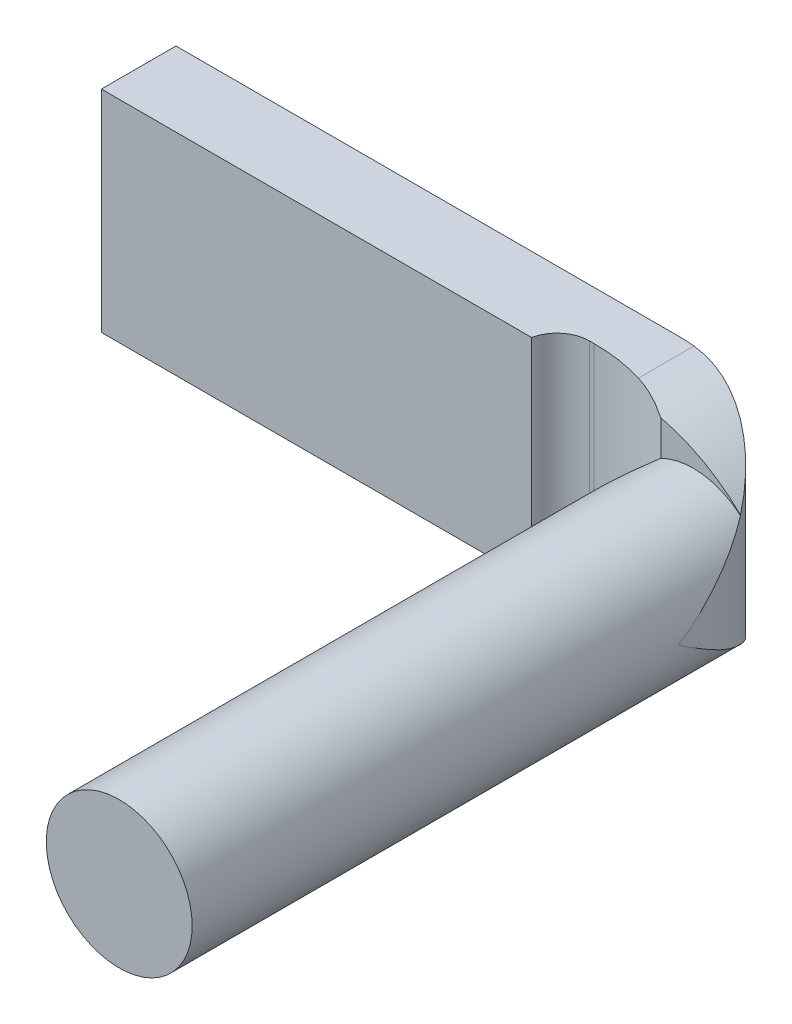
ISO-10303-21;
HEADER;
FILE_DESCRIPTION(('STEP AP214'),'2;1');
FILE_NAME('part.step','',(''),(''),'','','');
FILE_SCHEMA(('AUTOMOTIVE_DESIGN { 1 0 10303 214 1 1 1 1 }'));
ENDSEC;
DATA;
#1=APPLICATION_CONTEXT('core data for automotive mechanical design processes');
#2=APPLICATION_PROTOCOL_DEFINITION('international standard','automotive_design',2000,#1);
#3=PRODUCT_CONTEXT('',#1,'mechanical');
#4=PRODUCT('Part','Part','',(#3));
#5=PRODUCT_RELATED_PRODUCT_CATEGORY('part','',(#4));
#6=PRODUCT_DEFINITION_FORMATION('','',#4);
#7=PRODUCT_DEFINITION_CONTEXT('part definition',#1,'design');
#8=PRODUCT_DEFINITION('design','',#6,#7);
#9=PRODUCT_DEFINITION_SHAPE('','',#8);
#10=(LENGTH_UNIT() NAMED_UNIT(*) SI_UNIT(.MILLI.,.METRE.));
#11=(NAMED_UNIT(*) PLANE_ANGLE_UNIT() SI_UNIT($,.RADIAN.));
#12=(NAMED_UNIT(*) SI_UNIT($,.STERADIAN.) SOLID_ANGLE_UNIT());
#13=UNCERTAINTY_MEASURE_WITH_UNIT(LENGTH_MEASURE(1.E-05),#10,'distance_accuracy_value','');
#14=(GEOMETRIC_REPRESENTATION_CONTEXT(3) GLOBAL_UNCERTAINTY_ASSIGNED_CONTEXT((#13)) GLOBAL_UNIT_ASSIGNED_CONTEXT((#10,
#11,#12)) REPRESENTATION_CONTEXT('',''));
#15=CARTESIAN_POINT('',(0.,0.,0.));
#16=DIRECTION('',(0.,0.,1.));
#17=DIRECTION('',(1.,0.,0.));
#18=AXIS2_PLACEMENT_3D('',#15,#16,#17);
#19=CARTESIAN_POINT('',(-2.55,0.,0.));
#20=DIRECTION('',(-1.,0.,0.));
#21=DIRECTION('',(0.,0.,1.));
#22=AXIS2_PLACEMENT_3D('',#19,#20,#21);
#23=PLANE('',#22);
#24=DIRECTION('',(0.,0.,-1.));
#25=VECTOR('',#24,1.);
#26=CARTESIAN_POINT('',(-2.55,0.325,0.115));
#27=LINE('',#26,#25);
#28=CARTESIAN_POINT('',(-2.55,0.325,0.23));
#29=VERTEX_POINT('',#28);
#30=CARTESIAN_POINT('',(-2.55,0.325,0.));
#31=VERTEX_POINT('',#30);
#32=EDGE_CURVE('E11',#29,#31,#27,.T.);
#33=ORIENTED_EDGE('',*,*,#32,.T.);
#34=DIRECTION('',(0.,1.,0.));
#35=VECTOR('',#34,1.);
#36=CARTESIAN_POINT('',(-2.55,0.,0.));
#37=LINE('',#36,#35);
#38=CARTESIAN_POINT('',(-2.55,-0.325,0.));
#39=VERTEX_POINT('',#38);
#40=EDGE_CURVE('E43',#39,#31,#37,.T.);
#41=ORIENTED_EDGE('',*,*,#40,.F.);
#42=DIRECTION('',(0.,0.,-1.));
#43=VECTOR('',#42,1.);
#44=CARTESIAN_POINT('',(-2.55,-0.325,0.115));
#45=LINE('',#44,#43);
#46=CARTESIAN_POINT('',(-2.55,-0.325,0.23));
#47=VERTEX_POINT('',#46);
#48=EDGE_CURVE('E248',#47,#39,#45,.T.);
#49=ORIENTED_EDGE('',*,*,#48,.F.);
#50=DIRECTION('',(0.,1.,0.));
#51=VECTOR('',#50,1.);
#52=CARTESIAN_POINT('',(-2.55,0.,0.23));
#53=LINE('',#52,#51);
#54=EDGE_CURVE('E34',#47,#29,#53,.T.);
#55=ORIENTED_EDGE('',*,*,#54,.T.);
#56=EDGE_LOOP('',(#33,#41,#49,#55));
#57=FACE_BOUND('',#56,.T.);
#58=ADVANCED_FACE('F18',(#57),#23,.T.);
#59=CARTESIAN_POINT('',(-0.725,0.,2.));
#60=DIRECTION('',(0.,0.,1.));
#61=DIRECTION('',(-1.,0.,0.));
#62=AXIS2_PLACEMENT_3D('',#59,#60,#61);
#63=PLANE('',#62);
#64=CARTESIAN_POINT('',(-0.725,0.,2.));
#65=DIRECTION('',(0.,0.,1.));
#66=DIRECTION('',(1.,0.,0.));
#67=AXIS2_PLACEMENT_3D('',#64,#65,#66);
#68=CIRCLE('',#67,0.225);
#69=CARTESIAN_POINT('',(-0.5,0.,2.));
#70=VERTEX_POINT('',#69);
#71=EDGE_CURVE('E286',#70,#70,#68,.T.);
#72=ORIENTED_EDGE('',*,*,#71,.T.);
#73=EDGE_LOOP('',(#72));
#74=FACE_BOUND('',#73,.T.);
#75=ADVANCED_FACE('F294',(#74),#63,.T.);
#76=CARTESIAN_POINT('',(-0.95,0.,0.));
#77=DIRECTION('',(0.,0.,-1.));
#78=DIRECTION('',(-1.,0.,0.));
#79=AXIS2_PLACEMENT_3D('',#76,#77,#78);
#80=PLANE('',#79);
#81=DIRECTION('',(1.,0.,0.));
#82=VECTOR('',#81,1.);
#83=CARTESIAN_POINT('',(-1.775,-0.325,0.));
#84=LINE('',#83,#82);
#85=CARTESIAN_POINT('',(-1.,-0.325,0.));
#86=VERTEX_POINT('',#85);
#87=EDGE_CURVE('E264',#39,#86,#84,.T.);
#88=ORIENTED_EDGE('',*,*,#87,.F.);
#89=ORIENTED_EDGE('',*,*,#40,.T.);
#90=DIRECTION('',(1.,0.,0.));
#91=VECTOR('',#90,1.);
#92=CARTESIAN_POINT('',(-1.775,0.325,0.));
#93=LINE('',#92,#91);
#94=CARTESIAN_POINT('',(-1.,0.325,0.));
#95=VERTEX_POINT('',#94);
#96=EDGE_CURVE('E239',#31,#95,#93,.T.);
#97=ORIENTED_EDGE('',*,*,#96,.T.);
#98=DIRECTION('',(0.,-1.,0.));
#99=VECTOR('',#98,1.);
#100=CARTESIAN_POINT('',(-1.,0.,0.));
#101=LINE('',#100,#99);
#102=EDGE_CURVE('E237',#95,#86,#101,.T.);
#103=ORIENTED_EDGE('',*,*,#102,.T.);
#104=EDGE_LOOP('',(#88,#89,#97,#103));
#105=FACE_BOUND('',#104,.T.);
#106=ADVANCED_FACE('F292',(#105),#80,.T.);
#107=CARTESIAN_POINT('',(-1.,0.,0.5));
#108=DIRECTION('',(0.,-1.,0.));
#109=DIRECTION('',(0.,0.,-1.));
#110=AXIS2_PLACEMENT_3D('',#107,#108,#109);
#111=CYLINDRICAL_SURFACE('',#110,0.5);
#112=CARTESIAN_POINT('',(-1.,0.325,0.5));
#113=DIRECTION('',(0.,-1.,0.));
#114=DIRECTION('',(1.,0.,0.));
#115=AXIS2_PLACEMENT_3D('',#112,#113,#114);
#116=CIRCLE('',#115,0.5);
#117=CARTESIAN_POINT('',(-0.95,0.325,0.00250628144669002));
#118=VERTEX_POINT('',#117);
#119=EDGE_CURVE('E215',#95,#118,#116,.T.);
#120=ORIENTED_EDGE('',*,*,#119,.T.);
#121=CARTESIAN_POINT('',(-0.579167491749967,0.172905938131077,0.230000000000027));
#122=CARTESIAN_POINT('',(-0.594481525065583,0.188039794505541,0.206193075913775));
#123=CARTESIAN_POINT('',(-0.611813178746644,0.203249229350374,0.183578997305729));
#124=CARTESIAN_POINT('',(-0.650742706479108,0.232717496682813,0.141012563586862));
#125=CARTESIAN_POINT('',(-0.672390528760634,0.246962302652992,0.121096449289508));
#126=CARTESIAN_POINT('',(-0.714567445336262,0.270089914317339,0.088824390277777));
#127=CARTESIAN_POINT('',(-0.73428674237854,0.279462020808014,0.075770332042518));
#128=CARTESIAN_POINT('',(-0.775945619935217,0.29599327411751,0.052376650463509));
#129=CARTESIAN_POINT('',(-0.797868075556542,0.303167965097133,0.0420180423441926));
#130=CARTESIAN_POINT('',(-0.8410050902512,0.314049205941591,0.0254605018314506));
#131=CARTESIAN_POINT('',(-0.862008945004077,0.318060620307345,0.0189193070948811));
#132=CARTESIAN_POINT('',(-0.905259136136628,0.323566558397666,0.00853962233083629));
#133=CARTESIAN_POINT('',(-0.927517538496798,0.325029657332423,0.00473521208001916));
#134=CARTESIAN_POINT('',(-0.95,0.325,0.00250628144669));
#135=B_SPLINE_CURVE_WITH_KNOTS('',3,(#121,#122,#123,#124,#125,#126,#127,#128,#129,#130,#131,
#132,#133,#134),.UNSPECIFIED.,.F.,.F.,(4,2,2,2,2,2,4),(0.,0.0964010493014831,0.193990237511447,
0.270015277748108,0.345489399076702,0.412245993738809,0.479820124814963),.UNSPECIFIED.);
#136=CARTESIAN_POINT('',(-0.579167491749983,0.172905938131093,0.230000000000013));
#137=VERTEX_POINT('',#136);
#138=EDGE_CURVE('E133',#137,#118,#135,.T.);
#139=ORIENTED_EDGE('',*,*,#138,.F.);
#140=DIRECTION('',(0.,-1.,0.));
#141=VECTOR('',#140,1.);
#142=CARTESIAN_POINT('',(-0.57916749175,0.,0.23));
#143=LINE('',#142,#141);
#144=CARTESIAN_POINT('',(-0.57916749175,0.171341412208,0.23));
#145=VERTEX_POINT('',#144);
#146=EDGE_CURVE('E159',#137,#145,#143,.T.);
#147=ORIENTED_EDGE('',*,*,#146,.T.);
#148=CARTESIAN_POINT('',(-0.527543923575,0.107870746186,0.336337982877));
#149=CARTESIAN_POINT('',(-0.540125816335,0.130901746399,0.3000168389));
#150=CARTESIAN_POINT('',(-0.557180986132,0.152628205514,0.264269023359));
#151=CARTESIAN_POINT('',(-0.57916749175,0.171341412208,0.23));
#152=B_SPLINE_CURVE_WITH_KNOTS('',3,(#148,#149,#150,#151),.UNSPECIFIED.,.F.,.F.,(4,4),(0.,
0.190113694744),.UNSPECIFIED.);
#153=CARTESIAN_POINT('',(-0.527543923575,0.107870746186,0.336337982877));
#154=VERTEX_POINT('',#153);
#155=EDGE_CURVE('E191',#154,#145,#152,.T.);
#156=ORIENTED_EDGE('',*,*,#155,.F.);
#157=CARTESIAN_POINT('',(-0.527543923574693,0.107870746185996,0.336337982876891));
#158=CARTESIAN_POINT('',(-0.518440960230583,0.0911460138156062,0.36268821599974));
#159=CARTESIAN_POINT('',(-0.511636501217818,0.0737207800982361,0.389378552485713));
#160=CARTESIAN_POINT('',(-0.502543032630099,0.0383528458116824,0.442818084704401));
#161=CARTESIAN_POINT('',(-0.500211820365034,0.0204166183388116,0.469564322782211));
#162=CARTESIAN_POINT('',(-0.500004618686017,0.00166086531989147,0.497524114394659));
#163=CARTESIAN_POINT('',(-0.500000022910573,0.000830403620367272,0.498762092329549));
#164=CARTESIAN_POINT('',(-0.5,0.,0.5));
#165=B_SPLINE_CURVE_WITH_KNOTS('',3,(#157,#158,#159,#160,#161,#162,#163,#164),.UNSPECIFIED.,.F.,
.F.,(4,2,2,4),(0.,0.0974514562798899,0.193978900600145,0.198451057847243),.UNSPECIFIED.);
#166=CARTESIAN_POINT('',(-0.5,0.,0.5));
#167=VERTEX_POINT('',#166);
#168=EDGE_CURVE('E183',#167,#154,#165,.F.);
#169=ORIENTED_EDGE('',*,*,#168,.F.);
#170=CARTESIAN_POINT('',(-0.5,0.,0.5));
#171=CARTESIAN_POINT('',(-0.499999999999995,-5.7746565647226E-07,0.499999999719079));
#172=CARTESIAN_POINT('',(-0.50000000000294,-1.15490033675771E-06,0.499999936684402));
#173=CARTESIAN_POINT('',(-0.500000000013319,-2.29213045936201E-06,0.499999715348737));
#174=CARTESIAN_POINT('',(-0.500000000020776,-2.85182163147612E-06,0.499999556566385));
#175=CARTESIAN_POINT('',(-0.500000000039255,-3.95919585697985E-06,0.499999163683635));
#176=CARTESIAN_POINT('',(-0.50000000005036,-4.50623468956113E-06,0.499998927809302));
#177=CARTESIAN_POINT('',(-0.500000000075246,-5.57081136091133E-06,0.499998399947566));
#178=CARTESIAN_POINT('',(-0.500000000089024,-6.0883866244889E-06,0.499998108033506));
#179=CARTESIAN_POINT('',(-0.500000000136034,-7.70017729146235E-06,0.499997113561711));
#180=CARTESIAN_POINT('',(-0.500000000172913,-8.74810924054418E-06,0.499996335521057));
#181=CARTESIAN_POINT('',(-0.500000000252641,-1.0722570934034E-05,0.499994661489089));
#182=CARTESIAN_POINT('',(-0.500000000295434,-1.16501206008797E-05,0.499993766638062));
#183=CARTESIAN_POINT('',(-0.500000000450473,-1.47809998148364E-05,0.49999054380303));
#184=CARTESIAN_POINT('',(-0.50000000057136,-1.68299526184926E-05,0.499988063824963));
#185=CARTESIAN_POINT('',(-0.500000000825262,-2.04891682177724E-05,0.499982955865055));
#186=CARTESIAN_POINT('',(-0.500000000957627,-2.21133258570544E-05,0.499980337308505));
#187=CARTESIAN_POINT('',(-0.500000001486064,-2.82969486640992E-05,0.499970081006428));
#188=CARTESIAN_POINT('',(-0.500000001908255,-3.26097381353135E-05,0.499962299705483));
#189=CARTESIAN_POINT('',(-0.500000003011803,-4.01888087849095E-05,0.499947221084814));
#190=CARTESIAN_POINT('',(-0.500000003662283,-4.3516987373918E-05,0.499939955514118));
#191=CARTESIAN_POINT('',(-0.500000009147845,-6.75531891366545E-05,0.499891664233341));
#192=CARTESIAN_POINT('',(-0.500000019154832,-9.55202945833925E-05,0.499854710242689));
#193=CARTESIAN_POINT('',(-0.500000071572373,-0.000195367716785842,0.499716794837562));
#194=CARTESIAN_POINT('',(-0.500000140170535,-0.000261824816654125,0.499612916125663));
#195=CARTESIAN_POINT('',(-0.500000511581878,-0.000511006351205102,0.499230256781094));
#196=CARTESIAN_POINT('',(-0.500001014312389,-0.000699268173762711,0.498954443484109));
#197=CARTESIAN_POINT('',(-0.500003856194312,-0.00142606385921486,0.497883206572794));
#198=CARTESIAN_POINT('',(-0.500007871087961,-0.00195854133345431,0.497084556640982));
#199=CARTESIAN_POINT('',(-0.500076771192126,-0.00815726539404534,0.487795076818709));
#200=CARTESIAN_POINT('',(-0.500355441973697,-0.0138606232141957,0.479324064520508));
#201=CARTESIAN_POINT('',(-0.501331477690675,-0.0250674376145888,0.462615124055144));
#202=CARTESIAN_POINT('',(-0.502017105012857,-0.0305720749594833,0.454377199139787));
#203=CARTESIAN_POINT('',(-0.503879468104124,-0.0420390434768299,0.437184141332002));
#204=CARTESIAN_POINT('',(-0.505094716957693,-0.0479981716614765,0.428230911047886));
#205=CARTESIAN_POINT('',(-0.508029105175276,-0.0598869898264683,0.41029025565808));
#206=CARTESIAN_POINT('',(-0.509751945286597,-0.0658161262813432,0.401303075638004));
#207=CARTESIAN_POINT('',(-0.514883636991639,-0.0810810419502258,0.378029195880052));
#208=CARTESIAN_POINT('',(-0.51868534260577,-0.090340772860088,0.363776791364767));
#209=CARTESIAN_POINT('',(-0.527540539772817,-0.108320981797468,0.335698665857435));
#210=CARTESIAN_POINT('',(-0.532570656091618,-0.117048107823722,0.321869859257526));
#211=CARTESIAN_POINT('',(-0.542550377348907,-0.131894059665949,0.29785061018629));
#212=CARTESIAN_POINT('',(-0.547210651747034,-0.138123044146713,0.287608280410997));
#213=CARTESIAN_POINT('',(-0.557326571805109,-0.150243859940892,0.267255313930031));
#214=CARTESIAN_POINT('',(-0.562785428053575,-0.156134189896859,0.257145397304276));
#215=CARTESIAN_POINT('',(-0.580837760024188,-0.173578854076331,0.226352870219456));
#216=CARTESIAN_POINT('',(-0.594785929724175,-0.184404898280911,0.206003966195183));
#217=CARTESIAN_POINT('',(-0.621854431080329,-0.200394370742645,0.172386499919227));
#218=CARTESIAN_POINT('',(-0.634084338281593,-0.206292760317813,0.158748714413746));
#219=CARTESIAN_POINT('',(-0.660296698872883,-0.215942677378491,0.132659767095127));
#220=CARTESIAN_POINT('',(-0.674260735195237,-0.219714746487253,0.12019825499181));
#221=CARTESIAN_POINT('',(-0.700478133339872,-0.223959872929676,0.0993747031610667));
#222=CARTESIAN_POINT('',(-0.712408754564794,-0.22498449641405,0.0907213815422376));
#223=CARTESIAN_POINT('',(-0.73702286650893,-0.225015144183454,0.0744885496194592));
#224=CARTESIAN_POINT('',(-0.749707179184749,-0.224018923858933,0.0669102433692606));
#225=CARTESIAN_POINT('',(-0.775502345527364,-0.219651601881529,0.0529908897163963));
#226=CARTESIAN_POINT('',(-0.788615888039904,-0.216260611500969,0.0466607758104441));
#227=CARTESIAN_POINT('',(-0.814529567613934,-0.20687822084177,0.0354577109840535));
#228=CARTESIAN_POINT('',(-0.827330056476005,-0.200889895998203,0.0305830481924773));
#229=CARTESIAN_POINT('',(-0.85010565122619,-0.187410469631852,0.0228676611263404));
#230=CARTESIAN_POINT('',(-0.860221057719746,-0.180264084031154,0.0198343320112318));
#231=CARTESIAN_POINT('',(-0.879265691651152,-0.164260838122762,0.0146953957088722));
#232=CARTESIAN_POINT('',(-0.888195066049429,-0.155404190066863,0.0125896735074381));
#233=CARTESIAN_POINT('',(-0.904079409072409,-0.136740622816675,0.0092230938156569));
#234=CARTESIAN_POINT('',(-0.911112900633754,-0.127007064066505,0.00792399791257257));
#235=CARTESIAN_POINT('',(-0.923558664861053,-0.106504791521638,0.00583743618475401));
#236=CARTESIAN_POINT('',(-0.92897091216383,-0.0957360615359296,0.00504997836399645));
#237=CARTESIAN_POINT('',(-0.938112091955226,-0.0732072425005823,0.00382284058893593));
#238=CARTESIAN_POINT('',(-0.941800864215151,-0.0614304197024931,0.00339129391930888));
#239=CARTESIAN_POINT('',(-0.947206494141587,-0.0374257349796377,0.00278747785699791));
#240=CARTESIAN_POINT('',(-0.948923119734283,-0.0251978201469916,0.00261523897780932));
#241=CARTESIAN_POINT('',(-0.950348930624402,-0.000388879574343036,0.00247075344644313));
#242=CARTESIAN_POINT('',(-0.950019109389979,0.0121944276147387,0.00250239328482872));
#243=CARTESIAN_POINT('',(-0.947269624855378,0.0371288753863014,0.00278639433458647));
#244=CARTESIAN_POINT('',(-0.944849822592343,0.0494800004751957,0.0030387702227148));
#245=CARTESIAN_POINT('',(-0.937982004667755,0.0736321856334904,0.00384914197937647));
#246=CARTESIAN_POINT('',(-0.933528419636025,0.0854316365257677,0.00440797791671894));
#247=CARTESIAN_POINT('',(-0.922729942132688,0.108099093597959,0.00597677278862145));
#248=CARTESIAN_POINT('',(-0.916385197855847,0.118967172676019,0.00698669637820217));
#249=CARTESIAN_POINT('',(-0.902105724281706,0.139324258838854,0.00962402814170151));
#250=CARTESIAN_POINT('',(-0.894190994276466,0.148828253525003,0.0112438789247749));
#251=CARTESIAN_POINT('',(-0.877017293987928,0.166330810463455,0.0152807216180426));
#252=CARTESIAN_POINT('',(-0.867758750505332,0.174329848850762,0.0176974607420052));
#253=CARTESIAN_POINT('',(-0.84852673422226,0.188426462502223,0.0233937029224233));
#254=CARTESIAN_POINT('',(-0.838578817349748,0.194568942012197,0.0266485564598081));
#255=CARTESIAN_POINT('',(-0.818149199673654,0.2051353575974,0.0341153997181115));
#256=CARTESIAN_POINT('',(-0.807667566804579,0.209559511775742,0.0383272678597143));
#257=CARTESIAN_POINT('',(-0.786473842230216,0.216730603910395,0.0477368422310753));
#258=CARTESIAN_POINT('',(-0.775760598585738,0.219464393684984,0.0529418745510266));
#259=CARTESIAN_POINT('',(-0.754514982605415,0.22331752956292,0.0642450245099114));
#260=CARTESIAN_POINT('',(-0.743982786150128,0.224435384744095,0.0703439611930672));
#261=CARTESIAN_POINT('',(-0.719611343201793,0.22537479351995,0.0856845508384899));
#262=CARTESIAN_POINT('',(-0.705959886051496,0.224578281408322,0.0952632311985519));
#263=CARTESIAN_POINT('',(-0.67989469499513,0.220826438718933,0.115543888077977));
#264=CARTESIAN_POINT('',(-0.667480304880629,0.217872259688941,0.126245262806983));
#265=CARTESIAN_POINT('',(-0.639667805980957,0.208876350137451,0.152650011685078));
#266=CARTESIAN_POINT('',(-0.624874286057326,0.20209534970616,0.168734848432987));
#267=CARTESIAN_POINT('',(-0.597757873270918,0.186239466367043,0.202218744452926));
#268=CARTESIAN_POINT('',(-0.585474521489806,0.177132309856792,0.219633654588824));
#269=CARTESIAN_POINT('',(-0.566481219060837,0.160040585333462,0.250411071204898));
#270=CARTESIAN_POINT('',(-0.559160711928939,0.152412506091202,0.263604271008855));
#271=CARTESIAN_POINT('',(-0.545847165240752,0.136517304932122,0.290313784774415));
#272=CARTESIAN_POINT('',(-0.539856823018651,0.12824892956004,0.303830694803816));
#273=CARTESIAN_POINT('',(-0.529488196523895,0.111755532426113,0.3302703312761));
#274=CARTESIAN_POINT('',(-0.525035345630349,0.103557053487986,0.343180719778308));
#275=CARTESIAN_POINT('',(-0.517262496194663,0.0869132959860724,0.369057948462132));
#276=CARTESIAN_POINT('',(-0.513935415289248,0.0784699374909866,0.382023895553537));
#277=CARTESIAN_POINT('',(-0.509543915178299,0.0650393397582102,0.40247698984575));
#278=CARTESIAN_POINT('',(-0.508120563149782,0.0601196881791561,0.409933732734089));
#279=CARTESIAN_POINT('',(-0.505594505948632,0.050132147477499,0.425014585876456));
#280=CARTESIAN_POINT('',(-0.504498516434583,0.0450632295577383,0.432639149723475));
#281=CARTESIAN_POINT('',(-0.502417456804449,0.0335401408340406,0.449937456085319));
#282=CARTESIAN_POINT('',(-0.501539288877064,0.0270758654199153,0.459617230688682));
#283=CARTESIAN_POINT('',(-0.500390330425554,0.0145557655041719,0.478286356082829));
#284=CARTESIAN_POINT('',(-0.500080623086274,0.00850376100733665,0.487275617334357));
#285=CARTESIAN_POINT('',(-0.500007883608312,0.00195967380727145,0.497082879224255));
#286=CARTESIAN_POINT('',(-0.500003873126859,0.00142830634799508,0.49787984011282));
#287=CARTESIAN_POINT('',(-0.500001021687495,0.000701839873785785,0.498950597762499));
#288=CARTESIAN_POINT('',(-0.500000514979559,0.000512762286796911,0.499227600442628));
#289=CARTESIAN_POINT('',(-0.500000140932095,0.000262556252120364,0.499611842206289));
#290=CARTESIAN_POINT('',(-0.500000071902896,0.000195859263933365,0.499716098894184));
#291=CARTESIAN_POINT('',(-0.500000019217309,9.56803685713167E-05,0.499854463723489));
#292=CARTESIAN_POINT('',(-0.500000009170935,6.76484938693015E-05,0.499891502115669));
#293=CARTESIAN_POINT('',(-0.500000003668987,4.35707559920982E-05,0.499939900840703));
#294=CARTESIAN_POINT('',(-0.500000003017216,4.02399276543902E-05,0.4999471760554));
#295=CARTESIAN_POINT('',(-0.500000001911515,3.26518440456769E-05,0.499962274440237));
#296=CARTESIAN_POINT('',(-0.500000001488566,2.83322837427971E-05,0.499970065662499));
#297=CARTESIAN_POINT('',(-0.500000000959202,2.21390336537735E-05,0.49998033317559));
#298=CARTESIAN_POINT('',(-0.500000000826646,2.0512880538958E-05,0.499982953623646));
#299=CARTESIAN_POINT('',(-0.500000000572357,1.68488603562364E-05,0.499988064910426));
#300=CARTESIAN_POINT('',(-0.500000000451274,1.47970605402023E-05,0.499990546292259));
#301=CARTESIAN_POINT('',(-0.500000000295982,1.16620070598943E-05,0.499993770350119));
#302=CARTESIAN_POINT('',(-0.500000000253124,1.0733340887953E-05,0.499994665381864));
#303=CARTESIAN_POINT('',(-0.500000000173267,8.75653208842286E-06,0.499996339542637));
#304=CARTESIAN_POINT('',(-0.500000000136325,7.70736783759915E-06,0.499997117528257));
#305=CARTESIAN_POINT('',(-0.500000000089232,6.09378934873127E-06,0.49999811165523));
#306=CARTESIAN_POINT('',(-0.500000000075429,5.57567330498644E-06,0.499998403415165));
#307=CARTESIAN_POINT('',(-0.500000000050495,4.51001676625306E-06,0.49999893087842));
#308=CARTESIAN_POINT('',(-0.500000000039368,3.9624388036974E-06,0.499999166508188));
#309=CARTESIAN_POINT('',(-0.500000000020849,2.8540342160401E-06,0.499999558792632));
#310=CARTESIAN_POINT('',(-0.500000000013373,2.29385176436228E-06,0.499999717225388));
#311=CARTESIAN_POINT('',(-0.500000000002963,1.15569978006618E-06,0.499999937728278));
#312=CARTESIAN_POINT('',(-0.500000000000005,5.7783438215433E-07,0.5000000002811));
#313=CARTESIAN_POINT('',(-0.5,0.,0.5));
#314=B_SPLINE_CURVE_WITH_KNOTS('',3,(#170,#171,#172,#173,#174,#175,#176,#177,#178,#179,#180,
#181,#182,#183,#184,#185,#186,#187,#188,#189,#190,#191,#192,#193,#194,#195,#196,#197,#198,#199,
#200,#201,#202,#203,#204,#205,#206,#207,#208,#209,#210,#211,#212,#213,#214,#215,#216,#217,#218,
#219,#220,#221,#222,#223,#224,#225,#226,#227,#228,#229,#230,#231,#232,#233,#234,#235,#236,#237,
#238,#239,#240,#241,#242,#243,#244,#245,#246,#247,#248,#249,#250,#251,#252,#253,#254,#255,#256,
#257,#258,#259,#260,#261,#262,#263,#264,#265,#266,#267,#268,#269,#270,#271,#272,#273,#274,#275,
#276,#277,#278,#279,#280,#281,#282,#283,#284,#285,#286,#287,#288,#289,#290,#291,#292,#293,#294,
#295,#296,#297,#298,#299,#300,#301,#302,#303,#304,#305,#306,#307,#308,#309,#310,#311,#312,#313),
.UNSPECIFIED.,.T.,.F.,(4,2,2,2,2,2,2,2,2,2,2,2,2,2,2,2,2,2,2,2,2,2,2,2,2,2,2,2,2,2,2,2,2,2,2,2,
2,2,2,2,2,2,2,2,2,2,2,2,2,2,2,2,2,2,2,2,2,2,2,2,2,2,2,2,2,2,2,2,2,2,2,4),(0.,
1.73081609835374E-06,3.47040716672475E-06,5.25323568498868E-06,7.03374665238368E-06,
1.09318336468315E-05,1.479437407244E-05,2.44017944221211E-05,3.36378795214498E-05,
6.03092519918189E-05,8.42563181139126E-05,0.00022229250040564,0.000592952753172089,
0.00159392482742708,0.00447441292107584,0.0351056803844816,0.0648936861097581,
0.0973518372798823,0.130052751359972,0.182245940080448,0.23351427084973,0.272069646372068,
0.310784520242123,0.391173575239965,0.448726169459282,0.505712797126296,0.54986855272862,
0.594073380257858,0.638649716128756,0.683173413817709,0.721228691202684,0.759279248776537,
0.79535121866181,0.831423752837083,0.868299408427032,0.905179402942621,0.94276448458506,
0.980352065452337,1.01804320026582,1.05573138230784,1.09296718008298,1.13019117738902,
1.1664253914743,1.20265500492933,1.23916299081471,1.27570463889255,1.32551453812584,
1.37529787320142,1.44357334310021,1.51285307643799,1.56350643073711,1.61426158143418,
1.6620048928502,1.70944200370326,1.73657454047807,1.76423051775385,1.79923699712073,
1.83174205744391,1.83461647806194,1.83562177017628,1.8359937781864,1.83613212927437,
1.83615610585096,1.83618281286499,1.83619205690209,1.83620167287116,1.83620553819121,
1.83620943911154,1.83621122080514,1.83621300482074,1.83621474553438,1.83621647745565),.UNSPECIFIED.);
#315=CARTESIAN_POINT('',(-0.57916749175,-0.17134141220812,0.23));
#316=VERTEX_POINT('',#315);
#317=EDGE_CURVE('E150',#167,#316,#314,.T.);
#318=ORIENTED_EDGE('',*,*,#317,.T.);
#319=DIRECTION('',(0.,-1.,0.));
#320=VECTOR('',#319,1.);
#321=CARTESIAN_POINT('',(-0.57916749175,0.,0.23));
#322=LINE('',#321,#320);
#323=CARTESIAN_POINT('',(-0.579167491749983,-0.172905938131093,0.230000000000013));
#324=VERTEX_POINT('',#323);
#325=EDGE_CURVE('E160',#316,#324,#322,.T.);
#326=ORIENTED_EDGE('',*,*,#325,.T.);
#327=CARTESIAN_POINT('',(-0.579167491749967,-0.172905938131077,0.230000000000027));
#328=CARTESIAN_POINT('',(-0.594481525065583,-0.188039794505541,0.206193075913775));
#329=CARTESIAN_POINT('',(-0.611813178746644,-0.203249229350374,0.183578997305729));
#330=CARTESIAN_POINT('',(-0.650742706479108,-0.232717496682813,0.141012563586862));
#331=CARTESIAN_POINT('',(-0.672390528760634,-0.246962302652992,0.121096449289508));
#332=CARTESIAN_POINT('',(-0.714567445336262,-0.270089914317339,0.088824390277777));
#333=CARTESIAN_POINT('',(-0.73428674237854,-0.279462020808014,0.075770332042518));
#334=CARTESIAN_POINT('',(-0.775945619935217,-0.29599327411751,0.052376650463509));
#335=CARTESIAN_POINT('',(-0.797868075556542,-0.303167965097133,0.0420180423441926));
#336=CARTESIAN_POINT('',(-0.8410050902512,-0.314049205941591,0.0254605018314506));
#337=CARTESIAN_POINT('',(-0.862008945004077,-0.318060620307345,0.0189193070948811));
#338=CARTESIAN_POINT('',(-0.905259136136628,-0.323566558397666,0.00853962233083629));
#339=CARTESIAN_POINT('',(-0.927517538496798,-0.325029657332423,0.00473521208001916));
#340=CARTESIAN_POINT('',(-0.95,-0.325,0.00250628144669));
#341=B_SPLINE_CURVE_WITH_KNOTS('',3,(#327,#328,#329,#330,#331,#332,#333,#334,#335,#336,#337,
#338,#339,#340),.UNSPECIFIED.,.F.,.F.,(4,2,2,2,2,2,4),(0.,0.0964010493014831,0.193990237511447,
0.270015277748108,0.345489399076702,0.412245993738809,0.479820124814963),.UNSPECIFIED.);
#342=CARTESIAN_POINT('',(-0.95,-0.325,0.00250628144669002));
#343=VERTEX_POINT('',#342);
#344=EDGE_CURVE('E161',#324,#343,#341,.T.);
#345=ORIENTED_EDGE('',*,*,#344,.T.);
#346=CARTESIAN_POINT('',(-1.,-0.325,0.5));
#347=DIRECTION('',(0.,-1.,0.));
#348=DIRECTION('',(1.,0.,0.));
#349=AXIS2_PLACEMENT_3D('',#346,#347,#348);
#350=CIRCLE('',#349,0.5);
#351=EDGE_CURVE('E263',#86,#343,#350,.T.);
#352=ORIENTED_EDGE('',*,*,#351,.F.);
#353=ORIENTED_EDGE('',*,*,#102,.F.);
#354=EDGE_LOOP('',(#120,#139,#147,#156,#169,#318,#326,#345,#352,#353));
#355=FACE_BOUND('',#354,.T.);
#356=ADVANCED_FACE('F168',(#355),#111,.T.);
#357=CARTESIAN_POINT('',(-0.95,0.20312499994,0.72500000001));
#358=DIRECTION('',(0.,0.,-1.));
#359=DIRECTION('',(0.742268041335985,-0.670103092673986,0.));
#360=AXIS2_PLACEMENT_3D('',#357,#358,#359);
#361=CYLINDRICAL_SURFACE('',#360,0.52812499994);
#362=CARTESIAN_POINT('',(-0.825000000007677,-0.309993909829991,0.230000000006448));
#363=CARTESIAN_POINT('',(-0.834676549379911,-0.312352127918611,0.224117498867494));
#364=CARTESIAN_POINT('',(-0.844580958306375,-0.314473933293907,0.218508410761073));
#365=CARTESIAN_POINT('',(-0.864731610632075,-0.318170851198056,0.207913516823226));
#366=CARTESIAN_POINT('',(-0.874975234024688,-0.319749405079866,0.202923920506511));
#367=CARTESIAN_POINT('',(-0.895818132432998,-0.322318155738325,0.193566781305209));
#368=CARTESIAN_POINT('',(-0.906417457715009,-0.32330826898595,0.189199326800389));
#369=CARTESIAN_POINT('',(-0.927972917053432,-0.324652075526652,0.181096876654668));
#370=CARTESIAN_POINT('',(-0.93893092218072,-0.325001591338716,0.177366175373865));
#371=CARTESIAN_POINT('',(-0.950000000000394,-0.325,0.173987372509291));
#372=B_SPLINE_CURVE_WITH_KNOTS('',3,(#362,#363,#364,#365,#366,#367,#368,#369,#370,#371),
.UNSPECIFIED.,.F.,.F.,(4,2,2,2,4),(0.,0.0346987807954748,0.0691735235000202,0.103653158718882,
0.138356854162908),.UNSPECIFIED.);
#373=CARTESIAN_POINT('',(-0.825000000005828,-0.309993909829541,0.230000000003224));
#374=VERTEX_POINT('',#373);
#375=CARTESIAN_POINT('',(-0.950000000000197,-0.325,0.173987372509351));
#376=VERTEX_POINT('',#375);
#377=EDGE_CURVE('E223',#374,#376,#372,.T.);
#378=ORIENTED_EDGE('',*,*,#377,.T.);
#379=DIRECTION('',(0.,0.,1.));
#380=VECTOR('',#379,1.);
#381=CARTESIAN_POINT('',(-0.95,-0.325,0.72500000001));
#382=LINE('',#381,#380);
#383=EDGE_CURVE('E229',#343,#376,#382,.T.);
#384=ORIENTED_EDGE('',*,*,#383,.F.);
#385=ORIENTED_EDGE('',*,*,#344,.F.);
#386=CARTESIAN_POINT('',(-0.95,0.20312499994,0.23));
#387=DIRECTION('',(0.,0.,1.));
#388=DIRECTION('',(1.,0.,0.));
#389=AXIS2_PLACEMENT_3D('',#386,#387,#388);
#390=CIRCLE('',#389,0.52812499994);
#391=EDGE_CURVE('E227',#374,#324,#390,.T.);
#392=ORIENTED_EDGE('',*,*,#391,.F.);
#393=EDGE_LOOP('',(#378,#384,#385,#392));
#394=FACE_BOUND('',#393,.T.);
#395=ADVANCED_FACE('F272',(#394),#361,.T.);
#396=CARTESIAN_POINT('',(0.,-0.325,0.));
#397=DIRECTION('',(0.,-1.,0.));
#398=DIRECTION('',(1.,0.,0.));
#399=AXIS2_PLACEMENT_3D('',#396,#397,#398);
#400=PLANE('',#399);
#401=DIRECTION('',(-1.,0.,0.));
#402=VECTOR('',#401,1.);
#403=CARTESIAN_POINT('',(-1.88648979486,-0.325,0.23));
#404=LINE('',#403,#402);
#405=CARTESIAN_POINT('',(-1.22297958971,-0.325,0.23));
#406=VERTEX_POINT('',#405);
#407=EDGE_CURVE('E245',#406,#47,#404,.T.);
#408=ORIENTED_EDGE('',*,*,#407,.T.);
#409=ORIENTED_EDGE('',*,*,#48,.T.);
#410=ORIENTED_EDGE('',*,*,#87,.T.);
#411=ORIENTED_EDGE('',*,*,#351,.T.);
#412=ORIENTED_EDGE('',*,*,#383,.T.);
#413=CARTESIAN_POINT('',(-1.11065713716,-0.325,0.7));
#414=DIRECTION('',(0.,-1.,0.));
#415=DIRECTION('',(1.,0.,0.));
#416=AXIS2_PLACEMENT_3D('',#413,#414,#415);
#417=CIRCLE('',#416,0.55);
#418=CARTESIAN_POINT('',(-1.11065713716,-0.325,0.15));
#419=VERTEX_POINT('',#418);
#420=EDGE_CURVE('E234',#419,#376,#417,.T.);
#421=ORIENTED_EDGE('',*,*,#420,.F.);
#422=DIRECTION('',(1.,0.,0.));
#423=VECTOR('',#422,1.);
#424=CARTESIAN_POINT('',(-1.11782856858,-0.325,0.15));
#425=LINE('',#424,#423);
#426=CARTESIAN_POINT('',(-1.125,-0.325,0.15));
#427=VERTEX_POINT('',#426);
#428=EDGE_CURVE('E249',#427,#419,#425,.T.);
#429=ORIENTED_EDGE('',*,*,#428,.F.);
#430=CARTESIAN_POINT('',(-1.125,-0.325,0.25));
#431=DIRECTION('',(0.,-1.,0.));
#432=DIRECTION('',(1.,0.,0.));
#433=AXIS2_PLACEMENT_3D('',#430,#431,#432);
#434=CIRCLE('',#433,0.1);
#435=EDGE_CURVE('E252',#406,#427,#434,.T.);
#436=ORIENTED_EDGE('',*,*,#435,.F.);
#437=EDGE_LOOP('',(#408,#409,#410,#411,#412,#421,#429,#436));
#438=FACE_BOUND('',#437,.T.);
#439=ADVANCED_FACE('F269',(#438),#400,.T.);
#440=CARTESIAN_POINT('',(-0.5,0.,0.23));
#441=DIRECTION('',(0.,0.,1.));
#442=DIRECTION('',(-1.,0.,0.));
#443=AXIS2_PLACEMENT_3D('',#440,#441,#442);
#444=PLANE('',#443);
#445=ORIENTED_EDGE('',*,*,#391,.T.);
#446=ORIENTED_EDGE('',*,*,#325,.F.);
#447=CARTESIAN_POINT('',(-0.725,0.,0.23));
#448=DIRECTION('',(0.,0.,1.));
#449=DIRECTION('',(1.,0.,0.));
#450=AXIS2_PLACEMENT_3D('',#447,#448,#449);
#451=CIRCLE('',#450,0.225);
#452=CARTESIAN_POINT('',(-0.825000000002,-0.201556443703732,0.23));
#453=VERTEX_POINT('',#452);
#454=EDGE_CURVE('E190',#453,#316,#451,.T.);
#455=ORIENTED_EDGE('',*,*,#454,.F.);
#456=DIRECTION('',(0.,-1.,0.));
#457=VECTOR('',#456,1.);
#458=CARTESIAN_POINT('',(-0.825000000004,-0.255775176767,0.23));
#459=LINE('',#458,#457);
#460=EDGE_CURVE('E220',#453,#374,#459,.T.);
#461=ORIENTED_EDGE('',*,*,#460,.T.);
#462=EDGE_LOOP('',(#445,#446,#455,#461));
#463=FACE_BOUND('',#462,.T.);
#464=ADVANCED_FACE('F349',(#463),#444,.T.);
#465=CARTESIAN_POINT('',(-0.95,-0.20312499994,0.72500000001));
#466=DIRECTION('',(0.,0.,-1.));
#467=DIRECTION('',(0.,1.,0.));
#468=AXIS2_PLACEMENT_3D('',#465,#466,#467);
#469=CYLINDRICAL_SURFACE('',#468,0.52812499994);
#470=CARTESIAN_POINT('',(-0.825000000004707,0.309993909829268,0.230000000008253));
#471=CARTESIAN_POINT('',(-0.834676549377145,0.312352127917997,0.224117498869091));
#472=CARTESIAN_POINT('',(-0.844580958303826,0.314473933293393,0.218508410762474));
#473=CARTESIAN_POINT('',(-0.864731610629981,0.318170851197718,0.207913516824266));
#474=CARTESIAN_POINT('',(-0.874975234022831,0.319749405079605,0.202923920507385));
#475=CARTESIAN_POINT('',(-0.895818132431636,0.32231815573819,0.19356678130578));
#476=CARTESIAN_POINT('',(-0.906417457713906,0.323308268985864,0.189199326800824));
#477=CARTESIAN_POINT('',(-0.927972917052866,0.324652075526634,0.18109687665486));
#478=CARTESIAN_POINT('',(-0.938930922180434,0.325001591338716,0.177366175373952));
#479=CARTESIAN_POINT('',(-0.950000000000394,0.325,0.173987372509291));
#480=B_SPLINE_CURVE_WITH_KNOTS('',3,(#470,#471,#472,#473,#474,#475,#476,#477,#478,#479),
.UNSPECIFIED.,.F.,.F.,(4,2,2,2,4),(0.,0.0346987807963695,0.0691735235017937,0.103653158721534,
0.138356854166455),.UNSPECIFIED.);
#481=CARTESIAN_POINT('',(-0.825000000004353,0.309993909829181,0.230000000004126));
#482=VERTEX_POINT('',#481);
#483=CARTESIAN_POINT('',(-0.950000000000197,0.325,0.173987372509351));
#484=VERTEX_POINT('',#483);
#485=EDGE_CURVE('E22',#482,#484,#480,.T.);
#486=ORIENTED_EDGE('',*,*,#485,.F.);
#487=CARTESIAN_POINT('',(-0.95,-0.20312499994,0.23));
#488=DIRECTION('',(0.,0.,1.));
#489=DIRECTION('',(1.,0.,0.));
#490=AXIS2_PLACEMENT_3D('',#487,#488,#489);
#491=CIRCLE('',#490,0.52812499994);
#492=EDGE_CURVE('E143',#137,#482,#491,.T.);
#493=ORIENTED_EDGE('',*,*,#492,.F.);
#494=ORIENTED_EDGE('',*,*,#138,.T.);
#495=DIRECTION('',(0.,0.,1.));
#496=VECTOR('',#495,1.);
#497=CARTESIAN_POINT('',(-0.95,0.325,0.72500000001));
#498=LINE('',#497,#496);
#499=EDGE_CURVE('E131',#118,#484,#498,.T.);
#500=ORIENTED_EDGE('',*,*,#499,.T.);
#501=EDGE_LOOP('',(#486,#493,#494,#500));
#502=FACE_BOUND('',#501,.T.);
#503=ADVANCED_FACE('F132',(#502),#469,.T.);
#504=CARTESIAN_POINT('',(0.,0.325,0.));
#505=DIRECTION('',(0.,-1.,0.));
#506=DIRECTION('',(1.,0.,0.));
#507=AXIS2_PLACEMENT_3D('',#504,#505,#506);
#508=PLANE('',#507);
#509=CARTESIAN_POINT('',(-1.125,0.325,0.25));
#510=DIRECTION('',(0.,-1.,0.));
#511=DIRECTION('',(1.,0.,0.));
#512=AXIS2_PLACEMENT_3D('',#509,#510,#511);
#513=CIRCLE('',#512,0.1);
#514=CARTESIAN_POINT('',(-1.22297958971,0.325,0.23));
#515=VERTEX_POINT('',#514);
#516=CARTESIAN_POINT('',(-1.125,0.325,0.15));
#517=VERTEX_POINT('',#516);
#518=EDGE_CURVE('E137',#515,#517,#513,.T.);
#519=ORIENTED_EDGE('',*,*,#518,.T.);
#520=DIRECTION('',(1.,0.,0.));
#521=VECTOR('',#520,1.);
#522=CARTESIAN_POINT('',(-1.11782856858,0.325,0.15));
#523=LINE('',#522,#521);
#524=CARTESIAN_POINT('',(-1.11065713716,0.325,0.15));
#525=VERTEX_POINT('',#524);
#526=EDGE_CURVE('E141',#517,#525,#523,.T.);
#527=ORIENTED_EDGE('',*,*,#526,.T.);
#528=CARTESIAN_POINT('',(-1.11065713716,0.325,0.7));
#529=DIRECTION('',(0.,-1.,0.));
#530=DIRECTION('',(1.,0.,0.));
#531=AXIS2_PLACEMENT_3D('',#528,#529,#530);
#532=CIRCLE('',#531,0.55);
#533=EDGE_CURVE('E123',#525,#484,#532,.T.);
#534=ORIENTED_EDGE('',*,*,#533,.T.);
#535=ORIENTED_EDGE('',*,*,#499,.F.);
#536=ORIENTED_EDGE('',*,*,#119,.F.);
#537=ORIENTED_EDGE('',*,*,#96,.F.);
#538=ORIENTED_EDGE('',*,*,#32,.F.);
#539=DIRECTION('',(-1.,0.,0.));
#540=VECTOR('',#539,1.);
#541=CARTESIAN_POINT('',(-1.88648979486,0.325,0.23));
#542=LINE('',#541,#540);
#543=EDGE_CURVE('E197',#515,#29,#542,.T.);
#544=ORIENTED_EDGE('',*,*,#543,.F.);
#545=EDGE_LOOP('',(#519,#527,#534,#535,#536,#537,#538,#544));
#546=FACE_BOUND('',#545,.T.);
#547=ADVANCED_FACE('F140',(#546),#508,.F.);
#548=CARTESIAN_POINT('',(-0.5,0.,0.23));
#549=DIRECTION('',(0.,0.,1.));
#550=DIRECTION('',(-1.,0.,0.));
#551=AXIS2_PLACEMENT_3D('',#548,#549,#550);
#552=PLANE('',#551);
#553=CARTESIAN_POINT('',(-0.725,0.,0.23));
#554=DIRECTION('',(0.,0.,1.));
#555=DIRECTION('',(1.,0.,0.));
#556=AXIS2_PLACEMENT_3D('',#553,#554,#555);
#557=CIRCLE('',#556,0.225);
#558=CARTESIAN_POINT('',(-0.825000000002,0.201556443706471,0.23));
#559=VERTEX_POINT('',#558);
#560=EDGE_CURVE('E202',#145,#559,#557,.T.);
#561=ORIENTED_EDGE('',*,*,#560,.F.);
#562=ORIENTED_EDGE('',*,*,#146,.F.);
#563=ORIENTED_EDGE('',*,*,#492,.T.);
#564=DIRECTION('',(0.,-1.,0.));
#565=VECTOR('',#564,1.);
#566=CARTESIAN_POINT('',(-0.825000000004,0.255775176767,0.23));
#567=LINE('',#566,#565);
#568=EDGE_CURVE('E127',#482,#559,#567,.T.);
#569=ORIENTED_EDGE('',*,*,#568,.T.);
#570=EDGE_LOOP('',(#561,#562,#563,#569));
#571=FACE_BOUND('',#570,.T.);
#572=ADVANCED_FACE('F177',(#571),#552,.T.);
#573=CARTESIAN_POINT('',(-0.725,0.,1.115));
#574=DIRECTION('',(0.,0.,1.));
#575=DIRECTION('',(0.877582561890372,0.479425538604204,0.));
#576=AXIS2_PLACEMENT_3D('',#573,#574,#575);
#577=CYLINDRICAL_SURFACE('',#576,0.225);
#578=ORIENTED_EDGE('',*,*,#71,.F.);
#579=EDGE_LOOP('',(#578));
#580=FACE_BOUND('',#579,.T.);
#581=CARTESIAN_POINT('',(-0.725,0.,-0.0447477419452231));
#582=DIRECTION('',(0.939692620785813,0.,0.342020143325932));
#583=DIRECTION('',(-0.342020143325932,0.,0.939692620785813));
#584=AXIS2_PLACEMENT_3D('',#581,#582,#583);
#585=ELLIPSE('',#584,0.657855990036189,0.225);
#586=EDGE_CURVE('E196',#453,#559,#585,.F.);
#587=ORIENTED_EDGE('',*,*,#586,.F.);
#588=ORIENTED_EDGE('',*,*,#454,.T.);
#589=ORIENTED_EDGE('',*,*,#317,.F.);
#590=ORIENTED_EDGE('',*,*,#168,.T.);
#591=ORIENTED_EDGE('',*,*,#155,.T.);
#592=ORIENTED_EDGE('',*,*,#560,.T.);
#593=EDGE_LOOP('',(#587,#588,#589,#590,#591,#592));
#594=FACE_BOUND('',#593,.T.);
#595=ADVANCED_FACE('F171',(#580,#594),#577,.T.);
#596=CARTESIAN_POINT('',(-0.5,0.,0.23));
#597=DIRECTION('',(0.,0.,1.));
#598=DIRECTION('',(-1.,0.,0.));
#599=AXIS2_PLACEMENT_3D('',#596,#597,#598);
#600=PLANE('',#599);
#601=ORIENTED_EDGE('',*,*,#543,.T.);
#602=ORIENTED_EDGE('',*,*,#54,.F.);
#603=ORIENTED_EDGE('',*,*,#407,.F.);
#604=DIRECTION('',(0.,-1.,0.));
#605=VECTOR('',#604,1.);
#606=CARTESIAN_POINT('',(-1.22297958971,0.,0.23));
#607=LINE('',#606,#605);
#608=EDGE_CURVE('E251',#515,#406,#607,.T.);
#609=ORIENTED_EDGE('',*,*,#608,.F.);
#610=EDGE_LOOP('',(#601,#602,#603,#609));
#611=FACE_BOUND('',#610,.T.);
#612=ADVANCED_FACE('F176',(#611),#600,.T.);
#613=CARTESIAN_POINT('',(-0.825,0.,0.23));
#614=DIRECTION('',(0.939692620785813,0.,0.342020143325932));
#615=DIRECTION('',(-0.342020143325932,0.,0.939692620785813));
#616=AXIS2_PLACEMENT_3D('',#613,#614,#615);
#617=PLANE('',#616);
#618=ORIENTED_EDGE('',*,*,#586,.T.);
#619=DIRECTION('',(0.,-1.,0.));
#620=VECTOR('',#619,1.);
#621=CARTESIAN_POINT('',(-0.825,0.,0.23));
#622=LINE('',#621,#620);
#623=EDGE_CURVE('E128',#559,#453,#622,.T.);
#624=ORIENTED_EDGE('',*,*,#623,.T.);
#625=EDGE_LOOP('',(#618,#624));
#626=FACE_BOUND('',#625,.T.);
#627=ADVANCED_FACE('F390',(#626),#617,.F.);
#628=CARTESIAN_POINT('',(-1.11065713716,0.,0.7));
#629=DIRECTION('',(0.,-1.,0.));
#630=DIRECTION('',(0.,0.,-1.));
#631=AXIS2_PLACEMENT_3D('',#628,#629,#630);
#632=CYLINDRICAL_SURFACE('',#631,0.55);
#633=ORIENTED_EDGE('',*,*,#485,.T.);
#634=ORIENTED_EDGE('',*,*,#533,.F.);
#635=DIRECTION('',(0.,-1.,0.));
#636=VECTOR('',#635,1.);
#637=CARTESIAN_POINT('',(-1.11065713716,0.,0.15));
#638=LINE('',#637,#636);
#639=EDGE_CURVE('E129',#525,#419,#638,.T.);
#640=ORIENTED_EDGE('',*,*,#639,.T.);
#641=ORIENTED_EDGE('',*,*,#420,.T.);
#642=ORIENTED_EDGE('',*,*,#377,.F.);
#643=ORIENTED_EDGE('',*,*,#460,.F.);
#644=ORIENTED_EDGE('',*,*,#623,.F.);
#645=ORIENTED_EDGE('',*,*,#568,.F.);
#646=EDGE_LOOP('',(#633,#634,#640,#641,#642,#643,#644,#645));
#647=FACE_BOUND('',#646,.T.);
#648=ADVANCED_FACE('F120',(#647),#632,.F.);
#649=CARTESIAN_POINT('',(-1.125,0.,0.15));
#650=DIRECTION('',(0.,0.,-1.));
#651=DIRECTION('',(1.,0.,0.));
#652=AXIS2_PLACEMENT_3D('',#649,#650,#651);
#653=PLANE('',#652);
#654=DIRECTION('',(0.,-1.,0.));
#655=VECTOR('',#654,1.);
#656=CARTESIAN_POINT('',(-1.125,0.,0.15));
#657=LINE('',#656,#655);
#658=EDGE_CURVE('E235',#517,#427,#657,.T.);
#659=ORIENTED_EDGE('',*,*,#658,.T.);
#660=ORIENTED_EDGE('',*,*,#428,.T.);
#661=ORIENTED_EDGE('',*,*,#639,.F.);
#662=ORIENTED_EDGE('',*,*,#526,.F.);
#663=EDGE_LOOP('',(#659,#660,#661,#662));
#664=FACE_BOUND('',#663,.T.);
#665=ADVANCED_FACE('F274',(#664),#653,.F.);
#666=CARTESIAN_POINT('',(-1.125,0.,0.25));
#667=DIRECTION('',(0.,-1.,0.));
#668=DIRECTION('',(-1.,0.,0.));
#669=AXIS2_PLACEMENT_3D('',#666,#667,#668);
#670=CYLINDRICAL_SURFACE('',#669,0.1);
#671=ORIENTED_EDGE('',*,*,#658,.F.);
#672=ORIENTED_EDGE('',*,*,#518,.F.);
#673=ORIENTED_EDGE('',*,*,#608,.T.);
#674=ORIENTED_EDGE('',*,*,#435,.T.);
#675=EDGE_LOOP('',(#671,#672,#673,#674));
#676=FACE_BOUND('',#675,.T.);
#677=ADVANCED_FACE('F20',(#676),#670,.F.);
#678=CLOSED_SHELL('',(#58,#75,#106,#356,#395,#439,#464,#503,#547,#572,#595,#612,#627,#648,#665,#677));
#679=MANIFOLD_SOLID_BREP('B1',#678);
#680=ADVANCED_BREP_SHAPE_REPRESENTATION('',(#18,#679),#14);
#681=SHAPE_DEFINITION_REPRESENTATION(#9,#680);
ENDSEC;
END-ISO-10303-21;
